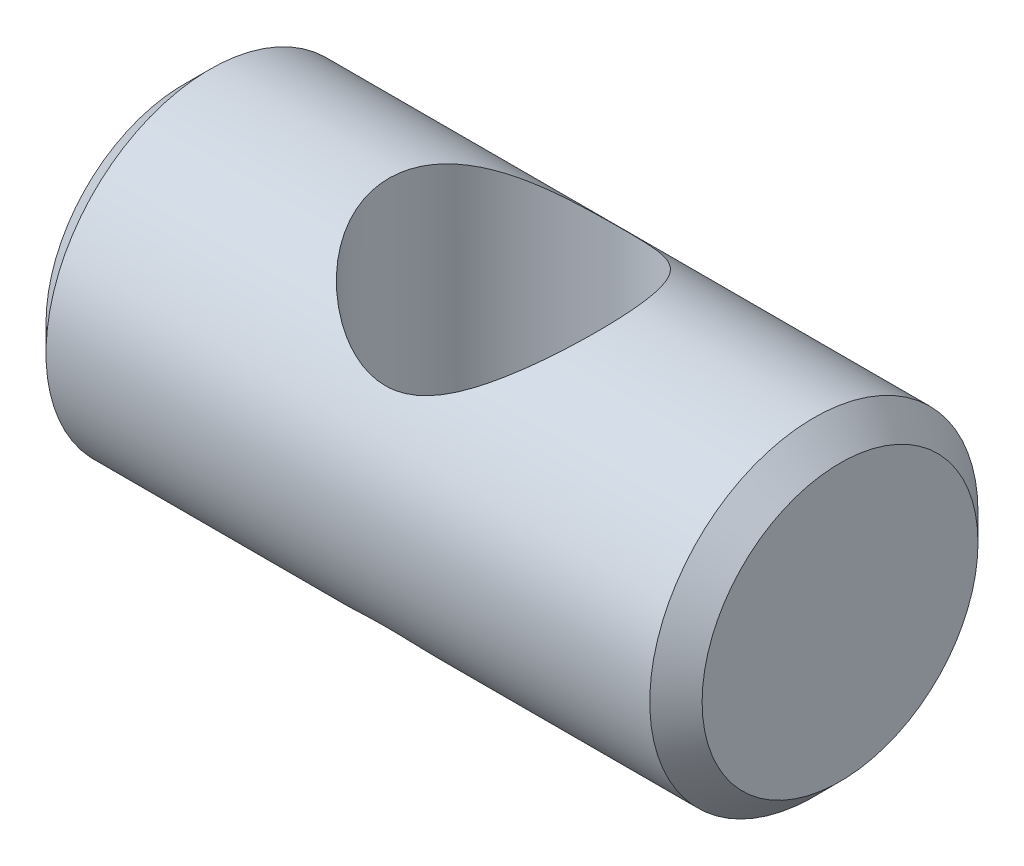
ISO-10303-21;
HEADER;
FILE_DESCRIPTION(('STEP AP214'),'2;1');
FILE_NAME('part.step','',(''),(''),'','','');
FILE_SCHEMA(('AUTOMOTIVE_DESIGN { 1 0 10303 214 1 1 1 1 }'));
ENDSEC;
DATA;
#1=APPLICATION_CONTEXT('core data for automotive mechanical design processes');
#2=APPLICATION_PROTOCOL_DEFINITION('international standard','automotive_design',2000,#1);
#3=PRODUCT_CONTEXT('',#1,'mechanical');
#4=PRODUCT('Part','Part','',(#3));
#5=PRODUCT_RELATED_PRODUCT_CATEGORY('part','',(#4));
#6=PRODUCT_DEFINITION_FORMATION('','',#4);
#7=PRODUCT_DEFINITION_CONTEXT('part definition',#1,'design');
#8=PRODUCT_DEFINITION('design','',#6,#7);
#9=PRODUCT_DEFINITION_SHAPE('','',#8);
#10=(LENGTH_UNIT() NAMED_UNIT(*) SI_UNIT(.MILLI.,.METRE.));
#11=(NAMED_UNIT(*) PLANE_ANGLE_UNIT() SI_UNIT($,.RADIAN.));
#12=(NAMED_UNIT(*) SI_UNIT($,.STERADIAN.) SOLID_ANGLE_UNIT());
#13=UNCERTAINTY_MEASURE_WITH_UNIT(LENGTH_MEASURE(1.E-05),#10,'distance_accuracy_value','');
#14=(GEOMETRIC_REPRESENTATION_CONTEXT(3) GLOBAL_UNCERTAINTY_ASSIGNED_CONTEXT((#13)) GLOBAL_UNIT_ASSIGNED_CONTEXT((#10,
#11,#12)) REPRESENTATION_CONTEXT('',''));
#15=CARTESIAN_POINT('',(0.,0.,0.));
#16=DIRECTION('',(0.,0.,1.));
#17=DIRECTION('',(1.,0.,0.));
#18=AXIS2_PLACEMENT_3D('',#15,#16,#17);
#19=CARTESIAN_POINT('',(9.525,0.,0.));
#20=DIRECTION('',(-1.,0.,0.));
#21=DIRECTION('',(0.,0.,1.));
#22=AXIS2_PLACEMENT_3D('',#19,#20,#21);
#23=CYLINDRICAL_SURFACE('',#22,4.765);
#24=CARTESIAN_POINT('',(0.,-3.0270158572429,3.68));
#25=CARTESIAN_POINT('',(0.0785672773316467,-3.02701614791727,3.67999984364138));
#26=CARTESIAN_POINT('',(0.157136135576355,-3.03031605642996,3.67729277636747));
#27=CARTESIAN_POINT('',(0.313369541449519,-3.04330147157753,3.66655295600809));
#28=CARTESIAN_POINT('',(0.391034010912772,-3.05298752605126,3.65851974601636));
#29=CARTESIAN_POINT('',(0.544942339151607,-3.07820352988238,3.63732812874269));
#30=CARTESIAN_POINT('',(0.621180877977562,-3.09375201630091,3.62415345944192));
#31=CARTESIAN_POINT('',(0.771468880528868,-3.12988210454059,3.59299821855179));
#32=CARTESIAN_POINT('',(0.845516665983408,-3.15046745848851,3.57501406328682));
#33=CARTESIAN_POINT('',(1.09433047382612,-3.22791462831318,3.50587087765695));
#34=CARTESIAN_POINT('',(1.26309282362243,-3.2948386580286,3.44382003292069));
#35=CARTESIAN_POINT('',(1.50370711041474,-3.40467601246938,3.33408533723918));
#36=CARTESIAN_POINT('',(1.58189244838755,-3.44290479326835,3.29468500807197));
#37=CARTESIAN_POINT('',(1.73423285237257,-3.52148653298938,3.21055545325705));
#38=CARTESIAN_POINT('',(1.80838881793449,-3.56183901380659,3.16582742418489));
#39=CARTESIAN_POINT('',(2.02850482582812,-3.68672600847629,3.02153691887044));
#40=CARTESIAN_POINT('',(2.16807869449588,-3.77315168849593,2.9137218740972));
#41=CARTESIAN_POINT('',(2.42959010373284,-3.94426933228633,2.67754924945123));
#42=CARTESIAN_POINT('',(2.55153658554773,-4.0289621561759,2.54920215427041));
#43=CARTESIAN_POINT('',(2.77693730786715,-4.1919505214112,2.27132648174837));
#44=CARTESIAN_POINT('',(2.88023478105728,-4.27018907543985,2.12163570850645));
#45=CARTESIAN_POINT('',(3.06369900830999,-4.41409842691616,1.80316374111448));
#46=CARTESIAN_POINT('',(3.14388622560065,-4.47978032533083,1.63439962117957));
#47=CARTESIAN_POINT('',(3.26635689009236,-4.58439476517905,1.30881127520956));
#48=CARTESIAN_POINT('',(3.3126324755552,-4.62591646772975,1.15433056577145));
#49=CARTESIAN_POINT('',(3.38325654959983,-4.69367027218436,0.83720228083025));
#50=CARTESIAN_POINT('',(3.40762001451853,-4.7199128126465,0.674560363681938));
#51=CARTESIAN_POINT('',(3.43267527752513,-4.75538994748078,0.345016918949483));
#52=CARTESIAN_POINT('',(3.43328564995364,-4.76456593536209,0.178102701594283));
#53=CARTESIAN_POINT('',(3.41018166140548,-4.76540378920208,-0.154080808504469));
#54=CARTESIAN_POINT('',(3.38646547727926,-4.75706434242047,-0.319349977022775));
#55=CARTESIAN_POINT('',(3.31775156953333,-4.72510260499364,-0.634317782486347));
#56=CARTESIAN_POINT('',(3.27397352746067,-4.70233080305011,-0.784375176401479));
#57=CARTESIAN_POINT('',(3.16750864597913,-4.64450941494238,-1.07505429218324));
#58=CARTESIAN_POINT('',(3.10481828431147,-4.60945754152293,-1.21567425043884));
#59=CARTESIAN_POINT('',(2.95652856255593,-4.52638674091887,-1.49677788855974));
#60=CARTESIAN_POINT('',(2.86942133720827,-4.47751111873768,-1.63620711351602));
#61=CARTESIAN_POINT('',(2.67788120319372,-4.37232420780869,-1.89951272145431));
#62=CARTESIAN_POINT('',(2.57343424063936,-4.31600689517522,-2.02337634423389));
#63=CARTESIAN_POINT('',(2.3299298971412,-4.18996971318213,-2.27426780979749));
#64=CARTESIAN_POINT('',(2.18800876851398,-4.11960732735628,-2.39819784816123));
#65=CARTESIAN_POINT('',(1.88505782163776,-3.98107848473248,-2.62174133186739));
#66=CARTESIAN_POINT('',(1.72402241690679,-3.91291267736107,-2.72134764203992));
#67=CARTESIAN_POINT('',(1.40961518716303,-3.79636450990898,-2.881168849186));
#68=CARTESIAN_POINT('',(1.25863725138286,-3.7465473111698,-2.94503209171547));
#69=CARTESIAN_POINT('',(0.945527440392475,-3.66060402226399,-3.05121747931763));
#70=CARTESIAN_POINT('',(0.783414037013451,-3.62445587601066,-3.09357436476774));
#71=CARTESIAN_POINT('',(0.53381305643861,-3.58476149841441,-3.13928376884266));
#72=CARTESIAN_POINT('',(0.449028547115522,-3.57393161480045,-3.15156761613341));
#73=CARTESIAN_POINT('',(0.278275024285709,-3.55780077117141,-3.16976872881678));
#74=CARTESIAN_POINT('',(0.192306660171832,-3.5524968934398,-3.17568935402606));
#75=CARTESIAN_POINT('',(0.0200327709043123,-3.54772147962291,-3.18102355866001));
#76=CARTESIAN_POINT('',(-0.0662726316081475,-3.54824798964232,-3.18043931801256));
#77=CARTESIAN_POINT('',(-0.238338872801629,-3.55508375410915,-3.17279435887041));
#78=CARTESIAN_POINT('',(-0.324099748085627,-3.56139261563451,-3.16573408043507));
#79=CARTESIAN_POINT('',(-0.553401842306178,-3.58576306843395,-3.13816835119393));
#80=CARTESIAN_POINT('',(-0.695739197403445,-3.60894237647337,-3.11173256017326));
#81=CARTESIAN_POINT('',(-0.973480788870412,-3.6678298405413,-3.04208625520151));
#82=CARTESIAN_POINT('',(-1.10887734054378,-3.70355155394913,-2.99885758403296));
#83=CARTESIAN_POINT('',(-1.42379146726814,-3.7997001514418,-2.87675019956371));
#84=CARTESIAN_POINT('',(-1.59919673865542,-3.86428769996493,-2.79052654374781));
#85=CARTESIAN_POINT('',(-1.93113815119942,-4.00059813210694,-2.59133845951309));
#86=CARTESIAN_POINT('',(-2.08764088718698,-4.07233325050109,-2.47832770642991));
#87=CARTESIAN_POINT('',(-2.38199709911894,-4.21579037939226,-2.22570370446708));
#88=CARTESIAN_POINT('',(-2.51955338419097,-4.28749766673045,-2.08573466326166));
#89=CARTESIAN_POINT('',(-2.77028243502779,-4.42234806198233,-1.78201502187867));
#90=CARTESIAN_POINT('',(-2.88349257282064,-4.48550424008068,-1.61830152645774));
#91=CARTESIAN_POINT('',(-3.06402610957439,-4.58658548395503,-1.30045140866569));
#92=CARTESIAN_POINT('',(-3.13591982023922,-4.62699541781642,-1.1497087789086));
#93=CARTESIAN_POINT('',(-3.25766051296821,-4.69370617156705,-0.836599849304387));
#94=CARTESIAN_POINT('',(-3.30752205037566,-4.7200163088041,-0.674241306034804));
#95=CARTESIAN_POINT('',(-3.3829870904449,-4.75572615385405,-0.341241432427479));
#96=CARTESIAN_POINT('',(-3.40846923089666,-4.7650414665297,-0.170563063438741));
#97=CARTESIAN_POINT('',(-3.4334390909829,-4.76495829995348,0.172677006169811));
#98=CARTESIAN_POINT('',(-3.43293306367628,-4.7555643228997,0.345238243758838));
#99=CARTESIAN_POINT('',(-3.40754400048731,-4.71998636563285,0.672126495727842));
#100=CARTESIAN_POINT('',(-3.38468468821344,-4.69525837988108,0.826779473459493));
#101=CARTESIAN_POINT('',(-3.31910619707247,-4.63193340521078,1.12882616508402));
#102=CARTESIAN_POINT('',(-3.27638180384756,-4.59333277548538,1.27621796175838));
#103=CARTESIAN_POINT('',(-3.17042951924722,-4.50215126554465,1.5686260572414));
#104=CARTESIAN_POINT('',(-3.10621371599284,-4.4489247354207,1.71307815224115));
#105=CARTESIAN_POINT('',(-2.96073945861412,-4.33272638873523,1.98874620073682));
#106=CARTESIAN_POINT('',(-2.87947919610231,-4.26975353829207,2.11996074756245));
#107=CARTESIAN_POINT('',(-2.68651050838254,-4.12556821291774,2.39003735747662));
#108=CARTESIAN_POINT('',(-2.57196063848181,-4.04309554925752,2.52618739114483));
#109=CARTESIAN_POINT('',(-2.32447412944916,-3.87408431941462,2.77844859407009));
#110=CARTESIAN_POINT('',(-2.19149095139183,-3.78753584009048,2.89450731580785));
#111=CARTESIAN_POINT('',(-1.96595276183287,-3.65130486353125,3.06263487303052));
#112=CARTESIAN_POINT('',(-1.87886470860018,-3.60090149373494,3.12157066922301));
#113=CARTESIAN_POINT('',(-1.69862262017004,-3.50236607543004,3.23173475735497));
#114=CARTESIAN_POINT('',(-1.60546616441238,-3.45423494663789,3.28295994638552));
#115=CARTESIAN_POINT('',(-1.41335402823623,-3.36225362869259,3.37709887635029));
#116=CARTESIAN_POINT('',(-1.31441341048654,-3.31839304937429,3.4200330530899));
#117=CARTESIAN_POINT('',(-1.11061583662532,-3.23713845030014,3.49704051581634));
#118=CARTESIAN_POINT('',(-1.00576424358736,-3.19973868995705,3.53112168161428));
#119=CARTESIAN_POINT('',(-0.826860618617416,-3.1451674862639,3.57966454279998));
#120=CARTESIAN_POINT('',(-0.754330914941612,-3.12542579098052,3.59686794878708));
#121=CARTESIAN_POINT('',(-0.607204587985835,-3.09080711138969,3.62665947956898));
#122=CARTESIAN_POINT('',(-0.532609008476298,-3.07592771737776,3.63924989089071));
#123=CARTESIAN_POINT('',(-0.382096659839412,-3.05181598122002,3.65949364139542));
#124=CARTESIAN_POINT('',(-0.306185151895194,-3.04256489437812,3.66716337327478));
#125=CARTESIAN_POINT('',(-0.153516252829605,-3.03016475948479,3.67741657137031));
#126=CARTESIAN_POINT('',(-0.0767588809019637,-3.02701557325904,3.68000015275969));
#127=CARTESIAN_POINT('',(0.,-3.0270158572429,3.68));
#128=B_SPLINE_CURVE_WITH_KNOTS('',3,(#24,#25,#26,#27,#28,#29,#30,#31,#32,#33,#34,#35,#36,#37,
#38,#39,#40,#41,#42,#43,#44,#45,#46,#47,#48,#49,#50,#51,#52,#53,#54,#55,#56,#57,#58,#59,#60,#61,
#62,#63,#64,#65,#66,#67,#68,#69,#70,#71,#72,#73,#74,#75,#76,#77,#78,#79,#80,#81,#82,#83,#84,#85,
#86,#87,#88,#89,#90,#91,#92,#93,#94,#95,#96,#97,#98,#99,#100,#101,#102,#103,#104,#105,#106,#107,
#108,#109,#110,#111,#112,#113,#114,#115,#116,#117,#118,#119,#120,#121,#122,#123,#124,#125,#126,
#127),.UNSPECIFIED.,.T.,.F.,(4,2,2,2,2,2,2,2,2,2,2,2,2,2,2,2,2,2,2,2,2,2,2,2,2,2,2,2,2,2,2,2,2,
2,2,2,2,2,2,2,2,2,2,2,2,2,2,2,2,2,2,4),(0.,0.235591708988226,0.471203630963839,
0.707566894291257,0.944106771258297,1.51591397043088,1.80236618274396,2.08875418016066,
2.67592975620557,3.26280644257577,3.85440755326201,4.44548320346413,4.94292664174491,
5.44002983205938,5.93883694376225,6.43768144120932,6.9095606777859,7.38152785217115,
7.89413675044232,8.40716316586385,9.00813916387888,9.60929124216606,10.1214610992978,
10.6328009675269,10.8914987801306,11.1500599316432,11.4085344360666,11.6669913779457,
12.1048085655684,12.5431004643862,13.1573710774192,13.7727118402267,14.3968121302921,
15.0199474601663,15.5333029695888,16.0463188267164,16.5618754223646,17.077307969612,
17.550023970907,18.0228641248864,18.5213957266873,19.0199802486027,19.6062313855034,
20.1939905554461,20.5434646283834,20.8930789631276,21.2418202453876,21.5902500511245,
21.8213124314337,22.0522601254179,22.2824343920731,22.5126034464923),.UNSPECIFIED.);
#129=CARTESIAN_POINT('',(0.,-3.0270158572429,3.68));
#130=VERTEX_POINT('',#129);
#131=EDGE_CURVE('E44',#130,#130,#128,.T.);
#132=ORIENTED_EDGE('',*,*,#131,.T.);
#133=EDGE_LOOP('',(#132));
#134=FACE_BOUND('',#133,.T.);
#135=CARTESIAN_POINT('',(0.,3.0270158572429,3.68));
#136=CARTESIAN_POINT('',(-0.0785672773316465,3.02701614791727,3.67999984364138));
#137=CARTESIAN_POINT('',(-0.157136135576355,3.03031605642996,3.67729277636747));
#138=CARTESIAN_POINT('',(-0.313369541449519,3.04330147157753,3.66655295600809));
#139=CARTESIAN_POINT('',(-0.391034010912771,3.05298752605126,3.65851974601636));
#140=CARTESIAN_POINT('',(-0.544942339151605,3.07820352988238,3.63732812874269));
#141=CARTESIAN_POINT('',(-0.62118087797756,3.09375201630091,3.62415345944192));
#142=CARTESIAN_POINT('',(-0.771468880528865,3.12988210454059,3.59299821855179));
#143=CARTESIAN_POINT('',(-0.845516665983405,3.15046745848851,3.57501406328682));
#144=CARTESIAN_POINT('',(-1.09433047382612,3.22791462831318,3.50587087765695));
#145=CARTESIAN_POINT('',(-1.26309282362243,3.2948386580286,3.44382003292069));
#146=CARTESIAN_POINT('',(-1.50370711041474,3.40467601246938,3.33408533723919));
#147=CARTESIAN_POINT('',(-1.58189244838754,3.44290479326835,3.29468500807198));
#148=CARTESIAN_POINT('',(-1.73423285237257,3.52148653298938,3.21055545325705));
#149=CARTESIAN_POINT('',(-1.80838881793448,3.56183901380659,3.16582742418489));
#150=CARTESIAN_POINT('',(-2.02850482582811,3.68672600847628,3.02153691887044));
#151=CARTESIAN_POINT('',(-2.16807869449587,3.77315168849593,2.9137218740972));
#152=CARTESIAN_POINT('',(-2.42959010373283,3.94426933228632,2.67754924945124));
#153=CARTESIAN_POINT('',(-2.55153658554772,4.0289621561759,2.54920215427042));
#154=CARTESIAN_POINT('',(-2.77693730786715,4.1919505214112,2.27132648174838));
#155=CARTESIAN_POINT('',(-2.88023478105728,4.27018907543984,2.12163570850646));
#156=CARTESIAN_POINT('',(-3.06369900830999,4.41409842691616,1.80316374111449));
#157=CARTESIAN_POINT('',(-3.14388622560065,4.47978032533083,1.63439962117957));
#158=CARTESIAN_POINT('',(-3.26635689009236,4.58439476517905,1.30881127520957));
#159=CARTESIAN_POINT('',(-3.3126324755552,4.62591646772974,1.15433056577145));
#160=CARTESIAN_POINT('',(-3.38325654959983,4.69367027218436,0.837202280830257));
#161=CARTESIAN_POINT('',(-3.40762001451853,4.71991281264649,0.674560363681945));
#162=CARTESIAN_POINT('',(-3.43267527752513,4.75538994748078,0.345016918949489));
#163=CARTESIAN_POINT('',(-3.43328564995364,4.76456593536209,0.178102701594289));
#164=CARTESIAN_POINT('',(-3.41018166140548,4.76540378920208,-0.154080808504464));
#165=CARTESIAN_POINT('',(-3.38646547727926,4.75706434242047,-0.31934997702277));
#166=CARTESIAN_POINT('',(-3.31775156953333,4.72510260499364,-0.634317782486343));
#167=CARTESIAN_POINT('',(-3.27397352746067,4.70233080305011,-0.784375176401475));
#168=CARTESIAN_POINT('',(-3.16750864597913,4.64450941494238,-1.07505429218324));
#169=CARTESIAN_POINT('',(-3.10481828431148,4.60945754152293,-1.21567425043883));
#170=CARTESIAN_POINT('',(-2.95652856255593,4.52638674091888,-1.49677788855974));
#171=CARTESIAN_POINT('',(-2.86942133720827,4.47751111873768,-1.63620711351601));
#172=CARTESIAN_POINT('',(-2.67788120319372,4.37232420780869,-1.89951272145431));
#173=CARTESIAN_POINT('',(-2.57343424063936,4.31600689517522,-2.02337634423388));
#174=CARTESIAN_POINT('',(-2.32992989714121,4.18996971318213,-2.27426780979749));
#175=CARTESIAN_POINT('',(-2.18800876851398,4.11960732735628,-2.39819784816122));
#176=CARTESIAN_POINT('',(-1.88505782163776,3.98107848473248,-2.62174133186739));
#177=CARTESIAN_POINT('',(-1.72402241690679,3.91291267736107,-2.72134764203992));
#178=CARTESIAN_POINT('',(-1.40961518716303,3.79636450990898,-2.881168849186));
#179=CARTESIAN_POINT('',(-1.25863725138286,3.7465473111698,-2.94503209171546));
#180=CARTESIAN_POINT('',(-0.945527440392477,3.66060402226399,-3.05121747931762));
#181=CARTESIAN_POINT('',(-0.783414037013454,3.62445587601066,-3.09357436476774));
#182=CARTESIAN_POINT('',(-0.533813056438614,3.58476149841442,-3.13928376884266));
#183=CARTESIAN_POINT('',(-0.449028547115525,3.57393161480045,-3.15156761613341));
#184=CARTESIAN_POINT('',(-0.278275024285712,3.55780077117141,-3.16976872881678));
#185=CARTESIAN_POINT('',(-0.192306660171835,3.5524968934398,-3.17568935402606));
#186=CARTESIAN_POINT('',(-0.0200327709043162,3.54772147962291,-3.18102355866001));
#187=CARTESIAN_POINT('',(0.0662726316081432,3.54824798964232,-3.18043931801256));
#188=CARTESIAN_POINT('',(0.238338872801624,3.55508375410915,-3.17279435887041));
#189=CARTESIAN_POINT('',(0.324099748085623,3.56139261563451,-3.16573408043508));
#190=CARTESIAN_POINT('',(0.553401842306172,3.58576306843395,-3.13816835119393));
#191=CARTESIAN_POINT('',(0.69573919740344,3.60894237647337,-3.11173256017326));
#192=CARTESIAN_POINT('',(0.973480788870407,3.6678298405413,-3.04208625520151));
#193=CARTESIAN_POINT('',(1.10887734054378,3.70355155394912,-2.99885758403296));
#194=CARTESIAN_POINT('',(1.42379146726814,3.7997001514418,-2.87675019956372));
#195=CARTESIAN_POINT('',(1.59919673865541,3.86428769996493,-2.79052654374781));
#196=CARTESIAN_POINT('',(1.93113815119942,4.00059813210694,-2.59133845951309));
#197=CARTESIAN_POINT('',(2.08764088718698,4.07233325050109,-2.47832770642991));
#198=CARTESIAN_POINT('',(2.38199709911893,4.21579037939226,-2.22570370446708));
#199=CARTESIAN_POINT('',(2.51955338419097,4.28749766673045,-2.08573466326166));
#200=CARTESIAN_POINT('',(2.77028243502778,4.42234806198233,-1.78201502187867));
#201=CARTESIAN_POINT('',(2.88349257282064,4.48550424008068,-1.61830152645775));
#202=CARTESIAN_POINT('',(3.06402610957439,4.58658548395503,-1.30045140866569));
#203=CARTESIAN_POINT('',(3.13591982023922,4.62699541781642,-1.14970877890861));
#204=CARTESIAN_POINT('',(3.25766051296821,4.69370617156705,-0.836599849304392));
#205=CARTESIAN_POINT('',(3.30752205037566,4.7200163088041,-0.67424130603481));
#206=CARTESIAN_POINT('',(3.3829870904449,4.75572615385405,-0.341241432427484));
#207=CARTESIAN_POINT('',(3.40846923089666,4.7650414665297,-0.170563063438745));
#208=CARTESIAN_POINT('',(3.4334390909829,4.76495829995348,0.172677006169808));
#209=CARTESIAN_POINT('',(3.43293306367628,4.7555643228997,0.345238243758835));
#210=CARTESIAN_POINT('',(3.40754400048731,4.71998636563285,0.672126495727839));
#211=CARTESIAN_POINT('',(3.38468468821344,4.69525837988108,0.82677947345949));
#212=CARTESIAN_POINT('',(3.31910619707247,4.63193340521078,1.12882616508402));
#213=CARTESIAN_POINT('',(3.27638180384756,4.59333277548538,1.27621796175837));
#214=CARTESIAN_POINT('',(3.17042951924722,4.50215126554465,1.56862605724139));
#215=CARTESIAN_POINT('',(3.10621371599284,4.4489247354207,1.71307815224114));
#216=CARTESIAN_POINT('',(2.96073945861412,4.33272638873523,1.98874620073681));
#217=CARTESIAN_POINT('',(2.87947919610232,4.26975353829207,2.11996074756245));
#218=CARTESIAN_POINT('',(2.68651050838254,4.12556821291774,2.39003735747662));
#219=CARTESIAN_POINT('',(2.57196063848181,4.04309554925752,2.52618739114482));
#220=CARTESIAN_POINT('',(2.32447412944917,3.87408431941462,2.77844859407009));
#221=CARTESIAN_POINT('',(2.19149095139184,3.78753584009048,2.89450731580784));
#222=CARTESIAN_POINT('',(1.96595276183287,3.65130486353125,3.06263487303052));
#223=CARTESIAN_POINT('',(1.87886470860019,3.60090149373494,3.12157066922301));
#224=CARTESIAN_POINT('',(1.69862262017005,3.50236607543005,3.23173475735497));
#225=CARTESIAN_POINT('',(1.60546616441238,3.45423494663789,3.28295994638551));
#226=CARTESIAN_POINT('',(1.41335402823624,3.36225362869259,3.37709887635029));
#227=CARTESIAN_POINT('',(1.31441341048654,3.31839304937429,3.4200330530899));
#228=CARTESIAN_POINT('',(1.11061583662532,3.23713845030014,3.49704051581634));
#229=CARTESIAN_POINT('',(1.00576424358737,3.19973868995705,3.53112168161428));
#230=CARTESIAN_POINT('',(0.82686061861742,3.1451674862639,3.57966454279998));
#231=CARTESIAN_POINT('',(0.754330914941614,3.12542579098052,3.59686794878708));
#232=CARTESIAN_POINT('',(0.607204587985836,3.09080711138969,3.62665947956898));
#233=CARTESIAN_POINT('',(0.532609008476299,3.07592771737776,3.63924989089071));
#234=CARTESIAN_POINT('',(0.382096659839412,3.05181598122002,3.65949364139542));
#235=CARTESIAN_POINT('',(0.306185151895194,3.04256489437811,3.66716337327478));
#236=CARTESIAN_POINT('',(0.153516252829605,3.03016475948479,3.67741657137031));
#237=CARTESIAN_POINT('',(0.0767588809019639,3.02701557325904,3.68000015275969));
#238=CARTESIAN_POINT('',(0.,3.0270158572429,3.68));
#239=B_SPLINE_CURVE_WITH_KNOTS('',3,(#135,#136,#137,#138,#139,#140,#141,#142,#143,#144,#145,
#146,#147,#148,#149,#150,#151,#152,#153,#154,#155,#156,#157,#158,#159,#160,#161,#162,#163,#164,
#165,#166,#167,#168,#169,#170,#171,#172,#173,#174,#175,#176,#177,#178,#179,#180,#181,#182,#183,
#184,#185,#186,#187,#188,#189,#190,#191,#192,#193,#194,#195,#196,#197,#198,#199,#200,#201,#202,
#203,#204,#205,#206,#207,#208,#209,#210,#211,#212,#213,#214,#215,#216,#217,#218,#219,#220,#221,
#222,#223,#224,#225,#226,#227,#228,#229,#230,#231,#232,#233,#234,#235,#236,#237,#238),
.UNSPECIFIED.,.T.,.F.,(4,2,2,2,2,2,2,2,2,2,2,2,2,2,2,2,2,2,2,2,2,2,2,2,2,2,2,2,2,2,2,2,2,2,2,2,
2,2,2,2,2,2,2,2,2,2,2,2,2,2,2,4),(0.,0.235591708988226,0.471203630963838,0.707566894291255,
0.944106771258294,1.51591397043087,1.80236618274396,2.08875418016066,2.67592975620556,
3.26280644257576,3.854407553262,4.44548320346412,4.94292664174491,5.44002983205938,
5.93883694376224,6.43768144120931,6.9095606777859,7.38152785217115,7.89413675044232,
8.40716316586385,9.00813916387887,9.60929124216605,10.1214610992978,10.6328009675269,
10.8914987801306,11.1500599316432,11.4085344360666,11.6669913779457,12.1048085655684,
12.5431004643861,13.1573710774192,13.7727118402267,14.3968121302921,15.0199474601663,
15.5333029695888,16.0463188267164,16.5618754223646,17.077307969612,17.550023970907,
18.0228641248864,18.5213957266873,19.0199802486027,19.6062313855034,20.1939905554461,
20.5434646283834,20.8930789631276,21.2418202453876,21.5902500511245,21.8213124314337,
22.0522601254179,22.2824343920731,22.5126034464923),.UNSPECIFIED.);
#240=CARTESIAN_POINT('',(0.,3.0270158572429,3.68));
#241=VERTEX_POINT('',#240);
#242=EDGE_CURVE('E61',#241,#241,#239,.T.);
#243=ORIENTED_EDGE('',*,*,#242,.T.);
#244=EDGE_LOOP('',(#243));
#245=FACE_BOUND('',#244,.T.);
#246=CARTESIAN_POINT('',(-8.76499999999999,0.,0.));
#247=DIRECTION('',(1.,0.,0.));
#248=DIRECTION('',(0.,0.,-1.));
#249=AXIS2_PLACEMENT_3D('',#246,#247,#248);
#250=CIRCLE('',#249,4.765);
#251=CARTESIAN_POINT('',(-8.76499999999999,0.,-4.765));
#252=VERTEX_POINT('',#251);
#253=EDGE_CURVE('E58',#252,#252,#250,.T.);
#254=ORIENTED_EDGE('',*,*,#253,.T.);
#255=EDGE_LOOP('',(#254));
#256=FACE_BOUND('',#255,.T.);
#257=CARTESIAN_POINT('',(8.76500000000001,0.,0.));
#258=DIRECTION('',(1.,0.,0.));
#259=DIRECTION('',(0.,0.,-1.));
#260=AXIS2_PLACEMENT_3D('',#257,#258,#259);
#261=CIRCLE('',#260,4.765);
#262=CARTESIAN_POINT('',(8.76500000000001,0.,-4.765));
#263=VERTEX_POINT('',#262);
#264=EDGE_CURVE('E98',#263,#263,#261,.F.);
#265=ORIENTED_EDGE('',*,*,#264,.T.);
#266=EDGE_LOOP('',(#265));
#267=FACE_BOUND('',#266,.T.);
#268=ADVANCED_FACE('F39',(#134,#245,#256,#267),#23,.T.);
#269=CARTESIAN_POINT('',(9.525,0.,0.));
#270=DIRECTION('',(1.,0.,0.));
#271=DIRECTION('',(0.,0.,-1.));
#272=AXIS2_PLACEMENT_3D('',#269,#270,#271);
#273=PLANE('',#272);
#274=CARTESIAN_POINT('',(9.525,0.,0.));
#275=DIRECTION('',(1.,0.,0.));
#276=DIRECTION('',(0.,0.,-1.));
#277=AXIS2_PLACEMENT_3D('',#274,#275,#276);
#278=CIRCLE('',#277,4.00500000000001);
#279=CARTESIAN_POINT('',(9.525,0.,-4.00500000000001));
#280=VERTEX_POINT('',#279);
#281=EDGE_CURVE('E10',#280,#280,#278,.T.);
#282=ORIENTED_EDGE('',*,*,#281,.T.);
#283=EDGE_LOOP('',(#282));
#284=FACE_BOUND('',#283,.T.);
#285=ADVANCED_FACE('F73',(#284),#273,.T.);
#286=CARTESIAN_POINT('',(-9.525,0.,0.));
#287=DIRECTION('',(1.,0.,0.));
#288=DIRECTION('',(0.,0.,-1.));
#289=AXIS2_PLACEMENT_3D('',#286,#287,#288);
#290=PLANE('',#289);
#291=CARTESIAN_POINT('',(-9.525,0.,0.));
#292=DIRECTION('',(1.,0.,0.));
#293=DIRECTION('',(0.,0.,-1.));
#294=AXIS2_PLACEMENT_3D('',#291,#292,#293);
#295=CIRCLE('',#294,4.00499999999998);
#296=CARTESIAN_POINT('',(-9.525,0.,-4.00499999999998));
#297=VERTEX_POINT('',#296);
#298=EDGE_CURVE('E53',#297,#297,#295,.F.);
#299=ORIENTED_EDGE('',*,*,#298,.T.);
#300=EDGE_LOOP('',(#299));
#301=FACE_BOUND('',#300,.T.);
#302=ADVANCED_FACE('F76',(#301),#290,.F.);
#303=CARTESIAN_POINT('',(-8.76499999999999,0.,0.));
#304=DIRECTION('',(1.,0.,0.));
#305=DIRECTION('',(0.,0.,-1.));
#306=AXIS2_PLACEMENT_3D('',#303,#304,#305);
#307=CONICAL_SURFACE('',#306,4.765,0.78539816339745);
#308=ORIENTED_EDGE('',*,*,#298,.F.);
#309=EDGE_LOOP('',(#308));
#310=FACE_BOUND('',#309,.T.);
#311=ORIENTED_EDGE('',*,*,#253,.F.);
#312=EDGE_LOOP('',(#311));
#313=FACE_BOUND('',#312,.T.);
#314=ADVANCED_FACE('F78',(#310,#313),#307,.T.);
#315=CARTESIAN_POINT('',(9.525,0.,0.));
#316=DIRECTION('',(-1.,0.,0.));
#317=DIRECTION('',(0.,0.,1.));
#318=AXIS2_PLACEMENT_3D('',#315,#316,#317);
#319=CONICAL_SURFACE('',#318,4.00500000000001,0.785398163397449);
#320=ORIENTED_EDGE('',*,*,#264,.F.);
#321=EDGE_LOOP('',(#320));
#322=FACE_BOUND('',#321,.T.);
#323=ORIENTED_EDGE('',*,*,#281,.F.);
#324=EDGE_LOOP('',(#323));
#325=FACE_BOUND('',#324,.T.);
#326=ADVANCED_FACE('F42',(#322,#325),#319,.T.);
#327=CARTESIAN_POINT('',(0.,-9.525,0.25));
#328=DIRECTION('',(0.,1.,0.));
#329=DIRECTION('',(0.,0.,1.));
#330=AXIS2_PLACEMENT_3D('',#327,#328,#329);
#331=CYLINDRICAL_SURFACE('',#330,3.43);
#332=ORIENTED_EDGE('',*,*,#242,.F.);
#333=EDGE_LOOP('',(#332));
#334=FACE_BOUND('',#333,.T.);
#335=ORIENTED_EDGE('',*,*,#131,.F.);
#336=EDGE_LOOP('',(#335));
#337=FACE_BOUND('',#336,.T.);
#338=ADVANCED_FACE('F68',(#334,#337),#331,.F.);
#339=CLOSED_SHELL('',(#268,#285,#302,#314,#326,#338));
#340=MANIFOLD_SOLID_BREP('B2',#339);
#341=ADVANCED_BREP_SHAPE_REPRESENTATION('',(#18,#340),#14);
#342=SHAPE_DEFINITION_REPRESENTATION(#9,#341);
ENDSEC;
END-ISO-10303-21;
